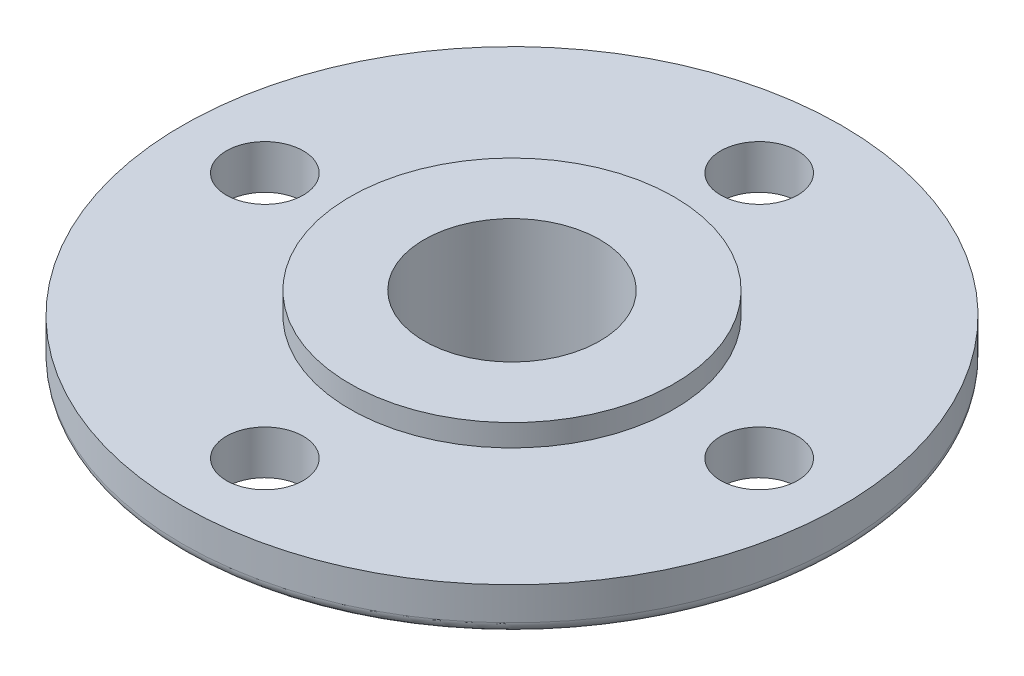
ISO-10303-21;
HEADER;
FILE_DESCRIPTION(('STEP AP214'),'2;1');
FILE_NAME('part.step','',(''),(''),'','','');
FILE_SCHEMA(('AUTOMOTIVE_DESIGN { 1 0 10303 214 1 1 1 1 }'));
ENDSEC;
DATA;
#1=APPLICATION_CONTEXT('core data for automotive mechanical design processes');
#2=APPLICATION_PROTOCOL_DEFINITION('international standard','automotive_design',2000,#1);
#3=PRODUCT_CONTEXT('',#1,'mechanical');
#4=PRODUCT('Part','Part','',(#3));
#5=PRODUCT_RELATED_PRODUCT_CATEGORY('part','',(#4));
#6=PRODUCT_DEFINITION_FORMATION('','',#4);
#7=PRODUCT_DEFINITION_CONTEXT('part definition',#1,'design');
#8=PRODUCT_DEFINITION('design','',#6,#7);
#9=PRODUCT_DEFINITION_SHAPE('','',#8);
#10=(LENGTH_UNIT() NAMED_UNIT(*) SI_UNIT(.MILLI.,.METRE.));
#11=(NAMED_UNIT(*) PLANE_ANGLE_UNIT() SI_UNIT($,.RADIAN.));
#12=(NAMED_UNIT(*) SI_UNIT($,.STERADIAN.) SOLID_ANGLE_UNIT());
#13=UNCERTAINTY_MEASURE_WITH_UNIT(LENGTH_MEASURE(1.E-05),#10,'distance_accuracy_value','');
#14=(GEOMETRIC_REPRESENTATION_CONTEXT(3) GLOBAL_UNCERTAINTY_ASSIGNED_CONTEXT((#13)) GLOBAL_UNIT_ASSIGNED_CONTEXT((#10,
#11,#12)) REPRESENTATION_CONTEXT('',''));
#15=CARTESIAN_POINT('',(0.,0.,0.));
#16=DIRECTION('',(0.,0.,1.));
#17=DIRECTION('',(1.,0.,0.));
#18=AXIS2_PLACEMENT_3D('',#15,#16,#17);
#19=CARTESIAN_POINT('',(-19.5,0.,0.));
#20=DIRECTION('',(0.,1.,0.));
#21=DIRECTION('',(0.,0.,1.));
#22=AXIS2_PLACEMENT_3D('',#19,#20,#21);
#23=PLANE('',#22);
#24=CARTESIAN_POINT('',(0.,0.,0.));
#25=DIRECTION('',(0.,-1.,0.));
#26=DIRECTION('',(0.,0.,-1.));
#27=AXIS2_PLACEMENT_3D('',#24,#25,#26);
#28=CIRCLE('',#27,16.);
#29=CARTESIAN_POINT('',(0.,0.,-16.));
#30=VERTEX_POINT('',#29);
#31=EDGE_CURVE('E10',#30,#30,#28,.T.);
#32=ORIENTED_EDGE('',*,*,#31,.F.);
#33=EDGE_LOOP('',(#32));
#34=FACE_BOUND('',#33,.T.);
#35=CARTESIAN_POINT('',(0.,0.,0.));
#36=DIRECTION('',(0.,-1.,0.));
#37=DIRECTION('',(0.,0.,-1.));
#38=AXIS2_PLACEMENT_3D('',#35,#36,#37);
#39=CIRCLE('',#38,19.5);
#40=CARTESIAN_POINT('',(0.,0.,-19.5));
#41=VERTEX_POINT('',#40);
#42=EDGE_CURVE('E51',#41,#41,#39,.T.);
#43=ORIENTED_EDGE('',*,*,#42,.T.);
#44=EDGE_LOOP('',(#43));
#45=FACE_BOUND('',#44,.T.);
#46=ADVANCED_FACE('F32',(#34,#45),#23,.F.);
#47=CARTESIAN_POINT('',(0.,0.,0.));
#48=DIRECTION('',(0.,-1.,0.));
#49=DIRECTION('',(0.,0.,-1.));
#50=AXIS2_PLACEMENT_3D('',#47,#48,#49);
#51=CYLINDRICAL_SURFACE('',#50,16.);
#52=CARTESIAN_POINT('',(0.,30.,0.));
#53=DIRECTION('',(0.,-1.,0.));
#54=DIRECTION('',(0.,0.,-1.));
#55=AXIS2_PLACEMENT_3D('',#52,#53,#54);
#56=CIRCLE('',#55,16.);
#57=CARTESIAN_POINT('',(0.,30.,-16.));
#58=VERTEX_POINT('',#57);
#59=EDGE_CURVE('E39',#58,#58,#56,.T.);
#60=ORIENTED_EDGE('',*,*,#59,.F.);
#61=EDGE_LOOP('',(#60));
#62=FACE_BOUND('',#61,.T.);
#63=ORIENTED_EDGE('',*,*,#31,.T.);
#64=EDGE_LOOP('',(#63));
#65=FACE_BOUND('',#64,.T.);
#66=ADVANCED_FACE('F100',(#62,#65),#51,.F.);
#67=CARTESIAN_POINT('',(-16.,30.,0.));
#68=DIRECTION('',(0.,-1.,0.));
#69=DIRECTION('',(0.,0.,-1.));
#70=AXIS2_PLACEMENT_3D('',#67,#68,#69);
#71=PLANE('',#70);
#72=CARTESIAN_POINT('',(0.,30.,0.));
#73=DIRECTION('',(0.,-1.,0.));
#74=DIRECTION('',(0.,0.,-1.));
#75=AXIS2_PLACEMENT_3D('',#72,#73,#74);
#76=CIRCLE('',#75,29.5);
#77=CARTESIAN_POINT('',(0.,30.,-29.5));
#78=VERTEX_POINT('',#77);
#79=EDGE_CURVE('E44',#78,#78,#76,.T.);
#80=ORIENTED_EDGE('',*,*,#79,.F.);
#81=EDGE_LOOP('',(#80));
#82=FACE_BOUND('',#81,.T.);
#83=ORIENTED_EDGE('',*,*,#59,.T.);
#84=EDGE_LOOP('',(#83));
#85=FACE_BOUND('',#84,.T.);
#86=ADVANCED_FACE('F97',(#82,#85),#71,.F.);
#87=CARTESIAN_POINT('',(0.,0.,0.));
#88=DIRECTION('',(0.,-1.,0.));
#89=DIRECTION('',(0.,0.,-1.));
#90=AXIS2_PLACEMENT_3D('',#87,#88,#89);
#91=CYLINDRICAL_SURFACE('',#90,29.5);
#92=CARTESIAN_POINT('',(0.,26.,0.));
#93=DIRECTION('',(0.,-1.,0.));
#94=DIRECTION('',(0.,0.,-1.));
#95=AXIS2_PLACEMENT_3D('',#92,#93,#94);
#96=CIRCLE('',#95,29.5);
#97=CARTESIAN_POINT('',(0.,26.,-29.5));
#98=VERTEX_POINT('',#97);
#99=EDGE_CURVE('E90',#98,#98,#96,.T.);
#100=ORIENTED_EDGE('',*,*,#99,.F.);
#101=EDGE_LOOP('',(#100));
#102=FACE_BOUND('',#101,.T.);
#103=ORIENTED_EDGE('',*,*,#79,.T.);
#104=EDGE_LOOP('',(#103));
#105=FACE_BOUND('',#104,.T.);
#106=ADVANCED_FACE('F95',(#102,#105),#91,.T.);
#107=CARTESIAN_POINT('',(-29.5,26.,0.));
#108=DIRECTION('',(0.,-1.,0.));
#109=DIRECTION('',(0.,0.,-1.));
#110=AXIS2_PLACEMENT_3D('',#107,#108,#109);
#111=PLANE('',#110);
#112=CARTESIAN_POINT('',(0.,26.,45.));
#113=DIRECTION('',(0.,1.,0.));
#114=DIRECTION('',(0.,0.,1.));
#115=AXIS2_PLACEMENT_3D('',#112,#113,#114);
#116=CIRCLE('',#115,7.);
#117=CARTESIAN_POINT('',(0.,26.,52.));
#118=VERTEX_POINT('',#117);
#119=EDGE_CURVE('E68',#118,#118,#116,.T.);
#120=ORIENTED_EDGE('',*,*,#119,.F.);
#121=EDGE_LOOP('',(#120));
#122=FACE_BOUND('',#121,.T.);
#123=CARTESIAN_POINT('',(45.,26.,0.));
#124=DIRECTION('',(0.,1.,0.));
#125=DIRECTION('',(0.,0.,1.));
#126=AXIS2_PLACEMENT_3D('',#123,#124,#125);
#127=CIRCLE('',#126,7.);
#128=CARTESIAN_POINT('',(45.,26.,6.99999999999999));
#129=VERTEX_POINT('',#128);
#130=EDGE_CURVE('E58',#129,#129,#127,.T.);
#131=ORIENTED_EDGE('',*,*,#130,.F.);
#132=EDGE_LOOP('',(#131));
#133=FACE_BOUND('',#132,.T.);
#134=CARTESIAN_POINT('',(0.,26.,-45.));
#135=DIRECTION('',(0.,1.,0.));
#136=DIRECTION('',(0.,0.,1.));
#137=AXIS2_PLACEMENT_3D('',#134,#135,#136);
#138=CIRCLE('',#137,7.);
#139=CARTESIAN_POINT('',(0.,26.,-38.));
#140=VERTEX_POINT('',#139);
#141=EDGE_CURVE('E55',#140,#140,#138,.T.);
#142=ORIENTED_EDGE('',*,*,#141,.F.);
#143=EDGE_LOOP('',(#142));
#144=FACE_BOUND('',#143,.T.);
#145=CARTESIAN_POINT('',(-45.,26.,0.));
#146=DIRECTION('',(0.,1.,0.));
#147=DIRECTION('',(0.,0.,1.));
#148=AXIS2_PLACEMENT_3D('',#145,#146,#147);
#149=CIRCLE('',#148,7.);
#150=CARTESIAN_POINT('',(-45.,26.,7.));
#151=VERTEX_POINT('',#150);
#152=EDGE_CURVE('E52',#151,#151,#149,.T.);
#153=ORIENTED_EDGE('',*,*,#152,.F.);
#154=EDGE_LOOP('',(#153));
#155=FACE_BOUND('',#154,.T.);
#156=CARTESIAN_POINT('',(0.,26.,0.));
#157=DIRECTION('',(0.,-1.,0.));
#158=DIRECTION('',(0.,0.,-1.));
#159=AXIS2_PLACEMENT_3D('',#156,#157,#158);
#160=CIRCLE('',#159,60.);
#161=CARTESIAN_POINT('',(0.,26.,-60.));
#162=VERTEX_POINT('',#161);
#163=EDGE_CURVE('E87',#162,#162,#160,.T.);
#164=ORIENTED_EDGE('',*,*,#163,.F.);
#165=EDGE_LOOP('',(#164));
#166=FACE_BOUND('',#165,.T.);
#167=ORIENTED_EDGE('',*,*,#99,.T.);
#168=EDGE_LOOP('',(#167));
#169=FACE_BOUND('',#168,.T.);
#170=ADVANCED_FACE('F112',(#122,#133,#144,#155,#166,#169),#111,.F.);
#171=CARTESIAN_POINT('',(0.,0.,0.));
#172=DIRECTION('',(0.,-1.,0.));
#173=DIRECTION('',(0.,0.,-1.));
#174=AXIS2_PLACEMENT_3D('',#171,#172,#173);
#175=CYLINDRICAL_SURFACE('',#174,60.);
#176=CARTESIAN_POINT('',(0.,20.,0.));
#177=DIRECTION('',(0.,-1.,0.));
#178=DIRECTION('',(0.,0.,-1.));
#179=AXIS2_PLACEMENT_3D('',#176,#177,#178);
#180=CIRCLE('',#179,60.);
#181=CARTESIAN_POINT('',(0.,20.,-60.));
#182=VERTEX_POINT('',#181);
#183=EDGE_CURVE('E84',#182,#182,#180,.T.);
#184=ORIENTED_EDGE('',*,*,#183,.F.);
#185=EDGE_LOOP('',(#184));
#186=FACE_BOUND('',#185,.T.);
#187=ORIENTED_EDGE('',*,*,#163,.T.);
#188=EDGE_LOOP('',(#187));
#189=FACE_BOUND('',#188,.T.);
#190=ADVANCED_FACE('F116',(#186,#189),#175,.T.);
#191=CARTESIAN_POINT('',(0.,20.,0.));
#192=DIRECTION('',(0.,-1.,0.));
#193=DIRECTION('',(0.,0.,-1.));
#194=AXIS2_PLACEMENT_3D('',#191,#192,#193);
#195=TOROIDAL_SURFACE('',#194,58.,2.);
#196=CARTESIAN_POINT('',(0.,18.,0.));
#197=DIRECTION('',(0.,-1.,0.));
#198=DIRECTION('',(0.,0.,-1.));
#199=AXIS2_PLACEMENT_3D('',#196,#197,#198);
#200=CIRCLE('',#199,58.);
#201=CARTESIAN_POINT('',(0.,18.,-58.));
#202=VERTEX_POINT('',#201);
#203=EDGE_CURVE('E81',#202,#202,#200,.T.);
#204=ORIENTED_EDGE('',*,*,#203,.F.);
#205=EDGE_LOOP('',(#204));
#206=FACE_BOUND('',#205,.T.);
#207=ORIENTED_EDGE('',*,*,#183,.T.);
#208=EDGE_LOOP('',(#207));
#209=FACE_BOUND('',#208,.T.);
#210=ADVANCED_FACE('F120',(#206,#209),#195,.T.);
#211=CARTESIAN_POINT('',(-58.,18.,0.));
#212=DIRECTION('',(0.,1.,0.));
#213=DIRECTION('',(0.,0.,1.));
#214=AXIS2_PLACEMENT_3D('',#211,#212,#213);
#215=PLANE('',#214);
#216=CARTESIAN_POINT('',(0.,18.,45.));
#217=DIRECTION('',(0.,1.,0.));
#218=DIRECTION('',(0.,0.,1.));
#219=AXIS2_PLACEMENT_3D('',#216,#217,#218);
#220=CIRCLE('',#219,7.);
#221=CARTESIAN_POINT('',(0.,18.,52.));
#222=VERTEX_POINT('',#221);
#223=EDGE_CURVE('E35',#222,#222,#220,.T.);
#224=ORIENTED_EDGE('',*,*,#223,.T.);
#225=EDGE_LOOP('',(#224));
#226=FACE_BOUND('',#225,.T.);
#227=CARTESIAN_POINT('',(45.,18.,0.));
#228=DIRECTION('',(0.,1.,0.));
#229=DIRECTION('',(0.,0.,1.));
#230=AXIS2_PLACEMENT_3D('',#227,#228,#229);
#231=CIRCLE('',#230,7.);
#232=CARTESIAN_POINT('',(45.,18.,6.99999999999999));
#233=VERTEX_POINT('',#232);
#234=EDGE_CURVE('E56',#233,#233,#231,.T.);
#235=ORIENTED_EDGE('',*,*,#234,.T.);
#236=EDGE_LOOP('',(#235));
#237=FACE_BOUND('',#236,.T.);
#238=CARTESIAN_POINT('',(0.,18.,-45.));
#239=DIRECTION('',(0.,1.,0.));
#240=DIRECTION('',(0.,0.,1.));
#241=AXIS2_PLACEMENT_3D('',#238,#239,#240);
#242=CIRCLE('',#241,7.);
#243=CARTESIAN_POINT('',(0.,18.,-38.));
#244=VERTEX_POINT('',#243);
#245=EDGE_CURVE('E53',#244,#244,#242,.T.);
#246=ORIENTED_EDGE('',*,*,#245,.T.);
#247=EDGE_LOOP('',(#246));
#248=FACE_BOUND('',#247,.T.);
#249=CARTESIAN_POINT('',(-45.,18.,0.));
#250=DIRECTION('',(0.,1.,0.));
#251=DIRECTION('',(0.,0.,1.));
#252=AXIS2_PLACEMENT_3D('',#249,#250,#251);
#253=CIRCLE('',#252,7.);
#254=CARTESIAN_POINT('',(-45.,18.,7.));
#255=VERTEX_POINT('',#254);
#256=EDGE_CURVE('E48',#255,#255,#253,.T.);
#257=ORIENTED_EDGE('',*,*,#256,.T.);
#258=EDGE_LOOP('',(#257));
#259=FACE_BOUND('',#258,.T.);
#260=CARTESIAN_POINT('',(0.,18.,0.));
#261=DIRECTION('',(0.,-1.,0.));
#262=DIRECTION('',(0.,0.,-1.));
#263=AXIS2_PLACEMENT_3D('',#260,#261,#262);
#264=CIRCLE('',#263,26.4801700249687);
#265=CARTESIAN_POINT('',(0.,18.,-26.4801700249687));
#266=VERTEX_POINT('',#265);
#267=EDGE_CURVE('E78',#266,#266,#264,.T.);
#268=ORIENTED_EDGE('',*,*,#267,.F.);
#269=EDGE_LOOP('',(#268));
#270=FACE_BOUND('',#269,.T.);
#271=ORIENTED_EDGE('',*,*,#203,.T.);
#272=EDGE_LOOP('',(#271));
#273=FACE_BOUND('',#272,.T.);
#274=ADVANCED_FACE('F124',(#226,#237,#248,#259,#270,#273),#215,.F.);
#275=CARTESIAN_POINT('',(0.,16.,0.));
#276=DIRECTION('',(0.,-1.,0.));
#277=DIRECTION('',(0.,0.,-1.));
#278=AXIS2_PLACEMENT_3D('',#275,#276,#277);
#279=TOROIDAL_SURFACE('',#278,26.4801700249687,2.);
#280=CARTESIAN_POINT('',(0.,16.584437071198,0.));
#281=DIRECTION('',(0.,-1.,0.));
#282=DIRECTION('',(0.,0.,-1.));
#283=AXIS2_PLACEMENT_3D('',#280,#281,#282);
#284=CIRCLE('',#283,24.5674668828661);
#285=CARTESIAN_POINT('',(0.,16.584437071198,-24.5674668828661));
#286=VERTEX_POINT('',#285);
#287=EDGE_CURVE('E75',#286,#286,#284,.T.);
#288=ORIENTED_EDGE('',*,*,#287,.F.);
#289=EDGE_LOOP('',(#288));
#290=FACE_BOUND('',#289,.T.);
#291=ORIENTED_EDGE('',*,*,#267,.T.);
#292=EDGE_LOOP('',(#291));
#293=FACE_BOUND('',#292,.T.);
#294=ADVANCED_FACE('F128',(#290,#293),#279,.F.);
#295=CARTESIAN_POINT('',(0.,16.584437071198,0.));
#296=DIRECTION('',(0.,1.,0.));
#297=DIRECTION('',(0.,0.,1.));
#298=AXIS2_PLACEMENT_3D('',#295,#296,#297);
#299=CONICAL_SURFACE('',#298,24.5674668828661,0.296545809069701);
#300=ORIENTED_EDGE('',*,*,#42,.F.);
#301=EDGE_LOOP('',(#300));
#302=FACE_BOUND('',#301,.T.);
#303=ORIENTED_EDGE('',*,*,#287,.T.);
#304=EDGE_LOOP('',(#303));
#305=FACE_BOUND('',#304,.T.);
#306=ADVANCED_FACE('F132',(#302,#305),#299,.T.);
#307=CARTESIAN_POINT('',(-45.,0.,0.));
#308=DIRECTION('',(0.,1.,0.));
#309=DIRECTION('',(0.,0.,1.));
#310=AXIS2_PLACEMENT_3D('',#307,#308,#309);
#311=CYLINDRICAL_SURFACE('',#310,7.);
#312=ORIENTED_EDGE('',*,*,#152,.T.);
#313=EDGE_LOOP('',(#312));
#314=FACE_BOUND('',#313,.T.);
#315=ORIENTED_EDGE('',*,*,#256,.F.);
#316=EDGE_LOOP('',(#315));
#317=FACE_BOUND('',#316,.T.);
#318=ADVANCED_FACE('F136',(#314,#317),#311,.F.);
#319=CARTESIAN_POINT('',(0.,0.,-45.));
#320=DIRECTION('',(0.,1.,0.));
#321=DIRECTION('',(0.,0.,1.));
#322=AXIS2_PLACEMENT_3D('',#319,#320,#321);
#323=CYLINDRICAL_SURFACE('',#322,7.);
#324=ORIENTED_EDGE('',*,*,#141,.T.);
#325=EDGE_LOOP('',(#324));
#326=FACE_BOUND('',#325,.T.);
#327=ORIENTED_EDGE('',*,*,#245,.F.);
#328=EDGE_LOOP('',(#327));
#329=FACE_BOUND('',#328,.T.);
#330=ADVANCED_FACE('F140',(#326,#329),#323,.F.);
#331=CARTESIAN_POINT('',(45.,0.,0.));
#332=DIRECTION('',(0.,1.,0.));
#333=DIRECTION('',(0.,0.,1.));
#334=AXIS2_PLACEMENT_3D('',#331,#332,#333);
#335=CYLINDRICAL_SURFACE('',#334,7.);
#336=ORIENTED_EDGE('',*,*,#130,.T.);
#337=EDGE_LOOP('',(#336));
#338=FACE_BOUND('',#337,.T.);
#339=ORIENTED_EDGE('',*,*,#234,.F.);
#340=EDGE_LOOP('',(#339));
#341=FACE_BOUND('',#340,.T.);
#342=ADVANCED_FACE('F144',(#338,#341),#335,.F.);
#343=CARTESIAN_POINT('',(0.,0.,45.));
#344=DIRECTION('',(0.,1.,0.));
#345=DIRECTION('',(0.,0.,1.));
#346=AXIS2_PLACEMENT_3D('',#343,#344,#345);
#347=CYLINDRICAL_SURFACE('',#346,7.);
#348=ORIENTED_EDGE('',*,*,#119,.T.);
#349=EDGE_LOOP('',(#348));
#350=FACE_BOUND('',#349,.T.);
#351=ORIENTED_EDGE('',*,*,#223,.F.);
#352=EDGE_LOOP('',(#351));
#353=FACE_BOUND('',#352,.T.);
#354=ADVANCED_FACE('F148',(#350,#353),#347,.F.);
#355=CLOSED_SHELL('',(#46,#66,#86,#106,#170,#190,#210,#274,#294,#306,#318,#330,#342,#354));
#356=MANIFOLD_SOLID_BREP('B2',#355);
#357=ADVANCED_BREP_SHAPE_REPRESENTATION('',(#18,#356),#14);
#358=SHAPE_DEFINITION_REPRESENTATION(#9,#357);
ENDSEC;
END-ISO-10303-21;
